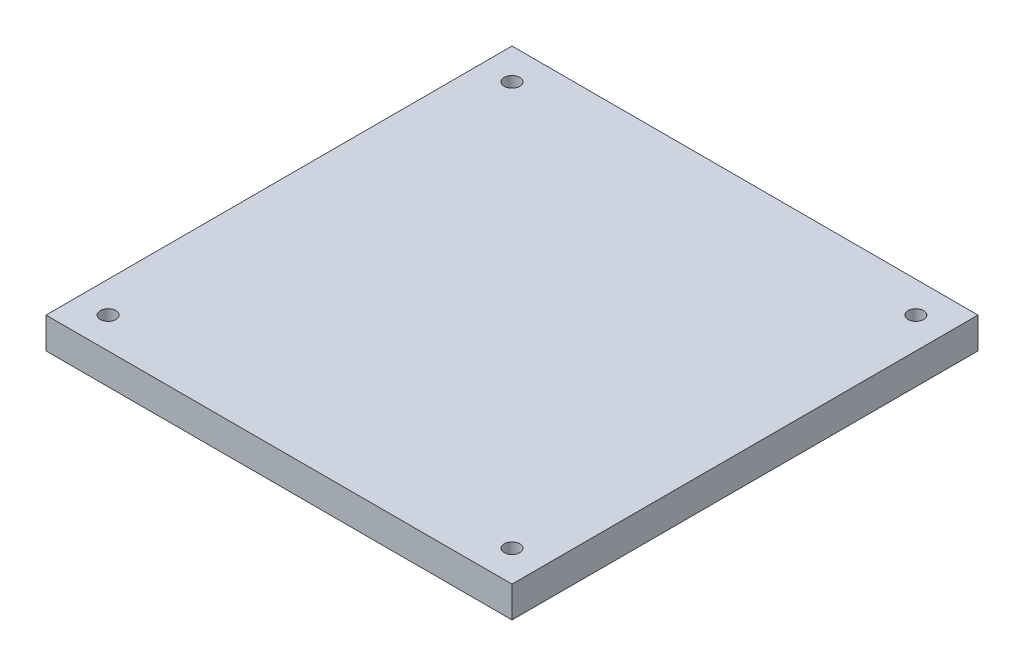
ISO-10303-21;
HEADER;
FILE_DESCRIPTION(('STEP AP214'),'2;1');
FILE_NAME('part.step','',(''),(''),'','','');
FILE_SCHEMA(('AUTOMOTIVE_DESIGN { 1 0 10303 214 1 1 1 1 }'));
ENDSEC;
DATA;
#1=APPLICATION_CONTEXT('core data for automotive mechanical design processes');
#2=APPLICATION_PROTOCOL_DEFINITION('international standard','automotive_design',2000,#1);
#3=PRODUCT_CONTEXT('',#1,'mechanical');
#4=PRODUCT('Part','Part','',(#3));
#5=PRODUCT_RELATED_PRODUCT_CATEGORY('part','',(#4));
#6=PRODUCT_DEFINITION_FORMATION('','',#4);
#7=PRODUCT_DEFINITION_CONTEXT('part definition',#1,'design');
#8=PRODUCT_DEFINITION('design','',#6,#7);
#9=PRODUCT_DEFINITION_SHAPE('','',#8);
#10=(LENGTH_UNIT() NAMED_UNIT(*) SI_UNIT(.MILLI.,.METRE.));
#11=(NAMED_UNIT(*) PLANE_ANGLE_UNIT() SI_UNIT($,.RADIAN.));
#12=(NAMED_UNIT(*) SI_UNIT($,.STERADIAN.) SOLID_ANGLE_UNIT());
#13=UNCERTAINTY_MEASURE_WITH_UNIT(LENGTH_MEASURE(1.E-05),#10,'distance_accuracy_value','');
#14=(GEOMETRIC_REPRESENTATION_CONTEXT(3) GLOBAL_UNCERTAINTY_ASSIGNED_CONTEXT((#13)) GLOBAL_UNIT_ASSIGNED_CONTEXT((#10,
#11,#12)) REPRESENTATION_CONTEXT('',''));
#15=CARTESIAN_POINT('',(0.,0.,0.));
#16=DIRECTION('',(0.,0.,1.));
#17=DIRECTION('',(1.,0.,0.));
#18=AXIS2_PLACEMENT_3D('',#15,#16,#17);
#19=CARTESIAN_POINT('',(75.,10.,-75.));
#20=DIRECTION('',(-1.,0.,0.));
#21=DIRECTION('',(0.,0.,1.));
#22=AXIS2_PLACEMENT_3D('',#19,#20,#21);
#23=PLANE('',#22);
#24=DIRECTION('',(0.,0.,-1.));
#25=VECTOR('',#24,1.);
#26=CARTESIAN_POINT('',(75.,0.,-75.));
#27=LINE('',#26,#25);
#28=CARTESIAN_POINT('',(75.,0.,75.));
#29=VERTEX_POINT('',#28);
#30=CARTESIAN_POINT('',(75.,0.,-75.));
#31=VERTEX_POINT('',#30);
#32=EDGE_CURVE('E99',#29,#31,#27,.T.);
#33=ORIENTED_EDGE('',*,*,#32,.T.);
#34=DIRECTION('',(0.,-1.,0.));
#35=VECTOR('',#34,1.);
#36=CARTESIAN_POINT('',(75.,10.,-75.));
#37=LINE('',#36,#35);
#38=CARTESIAN_POINT('',(75.,10.,-75.));
#39=VERTEX_POINT('',#38);
#40=EDGE_CURVE('E11',#39,#31,#37,.T.);
#41=ORIENTED_EDGE('',*,*,#40,.F.);
#42=DIRECTION('',(0.,0.,-1.));
#43=VECTOR('',#42,1.);
#44=CARTESIAN_POINT('',(75.,10.,-75.));
#45=LINE('',#44,#43);
#46=CARTESIAN_POINT('',(75.,10.,75.));
#47=VERTEX_POINT('',#46);
#48=EDGE_CURVE('E87',#47,#39,#45,.T.);
#49=ORIENTED_EDGE('',*,*,#48,.F.);
#50=DIRECTION('',(0.,-1.,0.));
#51=VECTOR('',#50,1.);
#52=CARTESIAN_POINT('',(75.,10.,75.));
#53=LINE('',#52,#51);
#54=EDGE_CURVE('E95',#47,#29,#53,.T.);
#55=ORIENTED_EDGE('',*,*,#54,.T.);
#56=EDGE_LOOP('',(#33,#41,#49,#55));
#57=FACE_BOUND('',#56,.T.);
#58=ADVANCED_FACE('F36',(#57),#23,.F.);
#59=CARTESIAN_POINT('',(-75.,10.,-75.));
#60=DIRECTION('',(0.,0.,1.));
#61=DIRECTION('',(1.,0.,0.));
#62=AXIS2_PLACEMENT_3D('',#59,#60,#61);
#63=PLANE('',#62);
#64=DIRECTION('',(-1.,0.,0.));
#65=VECTOR('',#64,1.);
#66=CARTESIAN_POINT('',(-75.,0.,-75.));
#67=LINE('',#66,#65);
#68=CARTESIAN_POINT('',(-75.,0.,-75.));
#69=VERTEX_POINT('',#68);
#70=EDGE_CURVE('E91',#31,#69,#67,.T.);
#71=ORIENTED_EDGE('',*,*,#70,.T.);
#72=DIRECTION('',(0.,-1.,0.));
#73=VECTOR('',#72,1.);
#74=CARTESIAN_POINT('',(-75.,10.,-75.));
#75=LINE('',#74,#73);
#76=CARTESIAN_POINT('',(-75.,10.,-75.));
#77=VERTEX_POINT('',#76);
#78=EDGE_CURVE('E44',#77,#69,#75,.T.);
#79=ORIENTED_EDGE('',*,*,#78,.F.);
#80=DIRECTION('',(-1.,0.,0.));
#81=VECTOR('',#80,1.);
#82=CARTESIAN_POINT('',(-75.,10.,-75.));
#83=LINE('',#82,#81);
#84=EDGE_CURVE('E82',#39,#77,#83,.T.);
#85=ORIENTED_EDGE('',*,*,#84,.F.);
#86=ORIENTED_EDGE('',*,*,#40,.T.);
#87=EDGE_LOOP('',(#71,#79,#85,#86));
#88=FACE_BOUND('',#87,.T.);
#89=ADVANCED_FACE('F90',(#88),#63,.F.);
#90=CARTESIAN_POINT('',(-75.,10.,-75.));
#91=DIRECTION('',(1.,0.,0.));
#92=DIRECTION('',(0.,0.,-1.));
#93=AXIS2_PLACEMENT_3D('',#90,#91,#92);
#94=PLANE('',#93);
#95=DIRECTION('',(0.,0.,1.));
#96=VECTOR('',#95,1.);
#97=CARTESIAN_POINT('',(-75.,0.,-75.));
#98=LINE('',#97,#96);
#99=CARTESIAN_POINT('',(-75.,0.,75.));
#100=VERTEX_POINT('',#99);
#101=EDGE_CURVE('E69',#69,#100,#98,.T.);
#102=ORIENTED_EDGE('',*,*,#101,.T.);
#103=DIRECTION('',(0.,-1.,0.));
#104=VECTOR('',#103,1.);
#105=CARTESIAN_POINT('',(-75.,10.,75.));
#106=LINE('',#105,#104);
#107=CARTESIAN_POINT('',(-75.,10.,75.));
#108=VERTEX_POINT('',#107);
#109=EDGE_CURVE('E92',#108,#100,#106,.T.);
#110=ORIENTED_EDGE('',*,*,#109,.F.);
#111=DIRECTION('',(0.,0.,1.));
#112=VECTOR('',#111,1.);
#113=CARTESIAN_POINT('',(-75.,10.,-75.));
#114=LINE('',#113,#112);
#115=EDGE_CURVE('E85',#77,#108,#114,.T.);
#116=ORIENTED_EDGE('',*,*,#115,.F.);
#117=ORIENTED_EDGE('',*,*,#78,.T.);
#118=EDGE_LOOP('',(#102,#110,#116,#117));
#119=FACE_BOUND('',#118,.T.);
#120=ADVANCED_FACE('F93',(#119),#94,.F.);
#121=CARTESIAN_POINT('',(-75.,10.,75.));
#122=DIRECTION('',(0.,0.,-1.));
#123=DIRECTION('',(-1.,0.,0.));
#124=AXIS2_PLACEMENT_3D('',#121,#122,#123);
#125=PLANE('',#124);
#126=DIRECTION('',(1.,0.,0.));
#127=VECTOR('',#126,1.);
#128=CARTESIAN_POINT('',(-75.,0.,75.));
#129=LINE('',#128,#127);
#130=EDGE_CURVE('E75',#100,#29,#129,.T.);
#131=ORIENTED_EDGE('',*,*,#130,.T.);
#132=ORIENTED_EDGE('',*,*,#54,.F.);
#133=DIRECTION('',(1.,0.,0.));
#134=VECTOR('',#133,1.);
#135=CARTESIAN_POINT('',(-75.,10.,75.));
#136=LINE('',#135,#134);
#137=EDGE_CURVE('E52',#108,#47,#136,.T.);
#138=ORIENTED_EDGE('',*,*,#137,.F.);
#139=ORIENTED_EDGE('',*,*,#109,.T.);
#140=EDGE_LOOP('',(#131,#132,#138,#139));
#141=FACE_BOUND('',#140,.T.);
#142=ADVANCED_FACE('F107',(#141),#125,.F.);
#143=CARTESIAN_POINT('',(0.,10.,0.));
#144=DIRECTION('',(0.,1.,0.));
#145=DIRECTION('',(0.,0.,1.));
#146=AXIS2_PLACEMENT_3D('',#143,#144,#145);
#147=PLANE('',#146);
#148=CARTESIAN_POINT('',(65.,10.,65.));
#149=DIRECTION('',(0.,-1.,0.));
#150=DIRECTION('',(0.,0.,-1.));
#151=AXIS2_PLACEMENT_3D('',#148,#149,#150);
#152=CIRCLE('',#151,2.5);
#153=CARTESIAN_POINT('',(65.,10.,62.5));
#154=VERTEX_POINT('',#153);
#155=EDGE_CURVE('E130',#154,#154,#152,.T.);
#156=ORIENTED_EDGE('',*,*,#155,.T.);
#157=EDGE_LOOP('',(#156));
#158=FACE_BOUND('',#157,.T.);
#159=CARTESIAN_POINT('',(65.,10.,-65.));
#160=DIRECTION('',(0.,-1.,0.));
#161=DIRECTION('',(0.,0.,-1.));
#162=AXIS2_PLACEMENT_3D('',#159,#160,#161);
#163=CIRCLE('',#162,2.5);
#164=CARTESIAN_POINT('',(65.,10.,-67.5));
#165=VERTEX_POINT('',#164);
#166=EDGE_CURVE('E124',#165,#165,#163,.T.);
#167=ORIENTED_EDGE('',*,*,#166,.T.);
#168=EDGE_LOOP('',(#167));
#169=FACE_BOUND('',#168,.T.);
#170=CARTESIAN_POINT('',(-65.,10.,-65.));
#171=DIRECTION('',(0.,-1.,0.));
#172=DIRECTION('',(0.,0.,-1.));
#173=AXIS2_PLACEMENT_3D('',#170,#171,#172);
#174=CIRCLE('',#173,2.5);
#175=CARTESIAN_POINT('',(-65.,10.,-67.5));
#176=VERTEX_POINT('',#175);
#177=EDGE_CURVE('E118',#176,#176,#174,.T.);
#178=ORIENTED_EDGE('',*,*,#177,.T.);
#179=EDGE_LOOP('',(#178));
#180=FACE_BOUND('',#179,.T.);
#181=CARTESIAN_POINT('',(-65.,10.,65.));
#182=DIRECTION('',(0.,-1.,0.));
#183=DIRECTION('',(0.,0.,-1.));
#184=AXIS2_PLACEMENT_3D('',#181,#182,#183);
#185=CIRCLE('',#184,2.5);
#186=CARTESIAN_POINT('',(-65.,10.,62.5));
#187=VERTEX_POINT('',#186);
#188=EDGE_CURVE('E102',#187,#187,#185,.T.);
#189=ORIENTED_EDGE('',*,*,#188,.T.);
#190=EDGE_LOOP('',(#189));
#191=FACE_BOUND('',#190,.T.);
#192=ORIENTED_EDGE('',*,*,#48,.T.);
#193=ORIENTED_EDGE('',*,*,#84,.T.);
#194=ORIENTED_EDGE('',*,*,#115,.T.);
#195=ORIENTED_EDGE('',*,*,#137,.T.);
#196=EDGE_LOOP('',(#192,#193,#194,#195));
#197=FACE_BOUND('',#196,.T.);
#198=ADVANCED_FACE('F83',(#158,#169,#180,#191,#197),#147,.T.);
#199=CARTESIAN_POINT('',(0.,0.,0.));
#200=DIRECTION('',(0.,1.,0.));
#201=DIRECTION('',(0.,0.,1.));
#202=AXIS2_PLACEMENT_3D('',#199,#200,#201);
#203=PLANE('',#202);
#204=CARTESIAN_POINT('',(65.,0.,65.));
#205=DIRECTION('',(0.,-1.,0.));
#206=DIRECTION('',(0.,0.,-1.));
#207=AXIS2_PLACEMENT_3D('',#204,#205,#206);
#208=CIRCLE('',#207,2.49999999999999);
#209=CARTESIAN_POINT('',(65.,0.,62.5));
#210=VERTEX_POINT('',#209);
#211=EDGE_CURVE('E133',#210,#210,#208,.T.);
#212=ORIENTED_EDGE('',*,*,#211,.F.);
#213=EDGE_LOOP('',(#212));
#214=FACE_BOUND('',#213,.T.);
#215=CARTESIAN_POINT('',(65.,0.,-65.));
#216=DIRECTION('',(0.,-1.,0.));
#217=DIRECTION('',(0.,0.,-1.));
#218=AXIS2_PLACEMENT_3D('',#215,#216,#217);
#219=CIRCLE('',#218,2.49999999999999);
#220=CARTESIAN_POINT('',(65.,0.,-67.5));
#221=VERTEX_POINT('',#220);
#222=EDGE_CURVE('E127',#221,#221,#219,.T.);
#223=ORIENTED_EDGE('',*,*,#222,.F.);
#224=EDGE_LOOP('',(#223));
#225=FACE_BOUND('',#224,.T.);
#226=CARTESIAN_POINT('',(-65.,0.,-65.));
#227=DIRECTION('',(0.,-1.,0.));
#228=DIRECTION('',(0.,0.,-1.));
#229=AXIS2_PLACEMENT_3D('',#226,#227,#228);
#230=CIRCLE('',#229,2.49999999999999);
#231=CARTESIAN_POINT('',(-65.,0.,-67.5));
#232=VERTEX_POINT('',#231);
#233=EDGE_CURVE('E121',#232,#232,#230,.T.);
#234=ORIENTED_EDGE('',*,*,#233,.F.);
#235=EDGE_LOOP('',(#234));
#236=FACE_BOUND('',#235,.T.);
#237=CARTESIAN_POINT('',(-65.,0.,65.));
#238=DIRECTION('',(0.,-1.,0.));
#239=DIRECTION('',(0.,0.,-1.));
#240=AXIS2_PLACEMENT_3D('',#237,#238,#239);
#241=CIRCLE('',#240,2.49999999999999);
#242=CARTESIAN_POINT('',(-65.,0.,62.5));
#243=VERTEX_POINT('',#242);
#244=EDGE_CURVE('E115',#243,#243,#241,.T.);
#245=ORIENTED_EDGE('',*,*,#244,.F.);
#246=EDGE_LOOP('',(#245));
#247=FACE_BOUND('',#246,.T.);
#248=ORIENTED_EDGE('',*,*,#32,.F.);
#249=ORIENTED_EDGE('',*,*,#130,.F.);
#250=ORIENTED_EDGE('',*,*,#101,.F.);
#251=ORIENTED_EDGE('',*,*,#70,.F.);
#252=EDGE_LOOP('',(#248,#249,#250,#251));
#253=FACE_BOUND('',#252,.T.);
#254=ADVANCED_FACE('F110',(#214,#225,#236,#247,#253),#203,.F.);
#255=CARTESIAN_POINT('',(-65.,0.,65.));
#256=DIRECTION('',(0.,-1.,0.));
#257=DIRECTION('',(0.,0.,-1.));
#258=AXIS2_PLACEMENT_3D('',#255,#256,#257);
#259=CYLINDRICAL_SURFACE('',#258,2.5);
#260=ORIENTED_EDGE('',*,*,#188,.F.);
#261=EDGE_LOOP('',(#260));
#262=FACE_BOUND('',#261,.T.);
#263=ORIENTED_EDGE('',*,*,#244,.T.);
#264=EDGE_LOOP('',(#263));
#265=FACE_BOUND('',#264,.T.);
#266=ADVANCED_FACE('F141',(#262,#265),#259,.F.);
#267=CARTESIAN_POINT('',(-65.,0.,-65.));
#268=DIRECTION('',(0.,-1.,0.));
#269=DIRECTION('',(0.,0.,-1.));
#270=AXIS2_PLACEMENT_3D('',#267,#268,#269);
#271=CYLINDRICAL_SURFACE('',#270,2.5);
#272=ORIENTED_EDGE('',*,*,#177,.F.);
#273=EDGE_LOOP('',(#272));
#274=FACE_BOUND('',#273,.T.);
#275=ORIENTED_EDGE('',*,*,#233,.T.);
#276=EDGE_LOOP('',(#275));
#277=FACE_BOUND('',#276,.T.);
#278=ADVANCED_FACE('F150',(#274,#277),#271,.F.);
#279=CARTESIAN_POINT('',(65.,0.,-65.));
#280=DIRECTION('',(0.,-1.,0.));
#281=DIRECTION('',(0.,0.,-1.));
#282=AXIS2_PLACEMENT_3D('',#279,#280,#281);
#283=CYLINDRICAL_SURFACE('',#282,2.5);
#284=ORIENTED_EDGE('',*,*,#166,.F.);
#285=EDGE_LOOP('',(#284));
#286=FACE_BOUND('',#285,.T.);
#287=ORIENTED_EDGE('',*,*,#222,.T.);
#288=EDGE_LOOP('',(#287));
#289=FACE_BOUND('',#288,.T.);
#290=ADVANCED_FACE('F156',(#286,#289),#283,.F.);
#291=CARTESIAN_POINT('',(65.,0.,65.));
#292=DIRECTION('',(0.,-1.,0.));
#293=DIRECTION('',(0.,0.,-1.));
#294=AXIS2_PLACEMENT_3D('',#291,#292,#293);
#295=CYLINDRICAL_SURFACE('',#294,2.5);
#296=ORIENTED_EDGE('',*,*,#155,.F.);
#297=EDGE_LOOP('',(#296));
#298=FACE_BOUND('',#297,.T.);
#299=ORIENTED_EDGE('',*,*,#211,.T.);
#300=EDGE_LOOP('',(#299));
#301=FACE_BOUND('',#300,.T.);
#302=ADVANCED_FACE('F137',(#298,#301),#295,.F.);
#303=CLOSED_SHELL('',(#58,#89,#120,#142,#198,#254,#266,#278,#290,#302));
#304=MANIFOLD_SOLID_BREP('B2',#303);
#305=ADVANCED_BREP_SHAPE_REPRESENTATION('',(#18,#304),#14);
#306=SHAPE_DEFINITION_REPRESENTATION(#9,#305);
ENDSEC;
END-ISO-10303-21;
